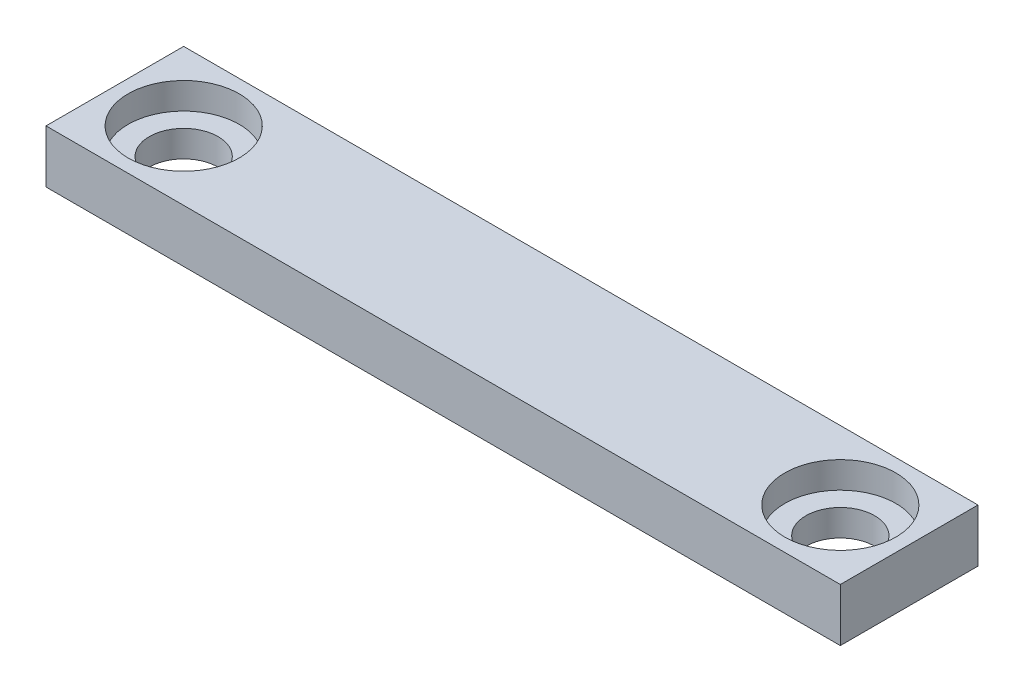
ISO-10303-21;
HEADER;
FILE_DESCRIPTION(('STEP AP214'),'2;1');
FILE_NAME('part.step','',(''),(''),'','','');
FILE_SCHEMA(('AUTOMOTIVE_DESIGN { 1 0 10303 214 1 1 1 1 }'));
ENDSEC;
DATA;
#1=APPLICATION_CONTEXT('core data for automotive mechanical design processes');
#2=APPLICATION_PROTOCOL_DEFINITION('international standard','automotive_design',2000,#1);
#3=PRODUCT_CONTEXT('',#1,'mechanical');
#4=PRODUCT('Part','Part','',(#3));
#5=PRODUCT_RELATED_PRODUCT_CATEGORY('part','',(#4));
#6=PRODUCT_DEFINITION_FORMATION('','',#4);
#7=PRODUCT_DEFINITION_CONTEXT('part definition',#1,'design');
#8=PRODUCT_DEFINITION('design','',#6,#7);
#9=PRODUCT_DEFINITION_SHAPE('','',#8);
#10=(LENGTH_UNIT() NAMED_UNIT(*) SI_UNIT(.MILLI.,.METRE.));
#11=(NAMED_UNIT(*) PLANE_ANGLE_UNIT() SI_UNIT($,.RADIAN.));
#12=(NAMED_UNIT(*) SI_UNIT($,.STERADIAN.) SOLID_ANGLE_UNIT());
#13=UNCERTAINTY_MEASURE_WITH_UNIT(LENGTH_MEASURE(1.E-05),#10,'distance_accuracy_value','');
#14=(GEOMETRIC_REPRESENTATION_CONTEXT(3) GLOBAL_UNCERTAINTY_ASSIGNED_CONTEXT((#13)) GLOBAL_UNIT_ASSIGNED_CONTEXT((#10,
#11,#12)) REPRESENTATION_CONTEXT('',''));
#15=CARTESIAN_POINT('',(0.,0.,0.));
#16=DIRECTION('',(0.,0.,1.));
#17=DIRECTION('',(1.,0.,0.));
#18=AXIS2_PLACEMENT_3D('',#15,#16,#17);
#19=CARTESIAN_POINT('',(0.,1.27,0.));
#20=DIRECTION('',(1.,0.,0.));
#21=DIRECTION('',(0.,0.,-1.));
#22=AXIS2_PLACEMENT_3D('',#19,#20,#21);
#23=PLANE('',#22);
#24=DIRECTION('',(0.,0.,1.));
#25=VECTOR('',#24,1.);
#26=CARTESIAN_POINT('',(0.,0.,0.));
#27=LINE('',#26,#25);
#28=CARTESIAN_POINT('',(0.,0.,-3.302));
#29=VERTEX_POINT('',#28);
#30=CARTESIAN_POINT('',(0.,0.,0.));
#31=VERTEX_POINT('',#30);
#32=EDGE_CURVE('E104',#29,#31,#27,.T.);
#33=ORIENTED_EDGE('',*,*,#32,.T.);
#34=DIRECTION('',(0.,-1.,0.));
#35=VECTOR('',#34,1.);
#36=CARTESIAN_POINT('',(0.,1.27,0.));
#37=LINE('',#36,#35);
#38=CARTESIAN_POINT('',(0.,1.27,0.));
#39=VERTEX_POINT('',#38);
#40=EDGE_CURVE('E11',#39,#31,#37,.T.);
#41=ORIENTED_EDGE('',*,*,#40,.F.);
#42=DIRECTION('',(0.,0.,1.));
#43=VECTOR('',#42,1.);
#44=CARTESIAN_POINT('',(0.,1.27,0.));
#45=LINE('',#44,#43);
#46=CARTESIAN_POINT('',(0.,1.27,-3.302));
#47=VERTEX_POINT('',#46);
#48=EDGE_CURVE('E92',#47,#39,#45,.T.);
#49=ORIENTED_EDGE('',*,*,#48,.F.);
#50=DIRECTION('',(0.,-1.,0.));
#51=VECTOR('',#50,1.);
#52=CARTESIAN_POINT('',(0.,1.27,-3.302));
#53=LINE('',#52,#51);
#54=EDGE_CURVE('E100',#47,#29,#53,.T.);
#55=ORIENTED_EDGE('',*,*,#54,.T.);
#56=EDGE_LOOP('',(#33,#41,#49,#55));
#57=FACE_BOUND('',#56,.T.);
#58=ADVANCED_FACE('F41',(#57),#23,.F.);
#59=CARTESIAN_POINT('',(0.,1.27,0.));
#60=DIRECTION('',(0.,0.,-1.));
#61=DIRECTION('',(-1.,0.,0.));
#62=AXIS2_PLACEMENT_3D('',#59,#60,#61);
#63=PLANE('',#62);
#64=DIRECTION('',(1.,0.,0.));
#65=VECTOR('',#64,1.);
#66=CARTESIAN_POINT('',(0.,0.,0.));
#67=LINE('',#66,#65);
#68=CARTESIAN_POINT('',(19.05,0.,0.));
#69=VERTEX_POINT('',#68);
#70=EDGE_CURVE('E96',#31,#69,#67,.T.);
#71=ORIENTED_EDGE('',*,*,#70,.T.);
#72=DIRECTION('',(0.,-1.,0.));
#73=VECTOR('',#72,1.);
#74=CARTESIAN_POINT('',(19.05,1.27,0.));
#75=LINE('',#74,#73);
#76=CARTESIAN_POINT('',(19.05,1.27,0.));
#77=VERTEX_POINT('',#76);
#78=EDGE_CURVE('E49',#77,#69,#75,.T.);
#79=ORIENTED_EDGE('',*,*,#78,.F.);
#80=DIRECTION('',(1.,0.,0.));
#81=VECTOR('',#80,1.);
#82=CARTESIAN_POINT('',(0.,1.27,0.));
#83=LINE('',#82,#81);
#84=EDGE_CURVE('E87',#39,#77,#83,.T.);
#85=ORIENTED_EDGE('',*,*,#84,.F.);
#86=ORIENTED_EDGE('',*,*,#40,.T.);
#87=EDGE_LOOP('',(#71,#79,#85,#86));
#88=FACE_BOUND('',#87,.T.);
#89=ADVANCED_FACE('F95',(#88),#63,.F.);
#90=CARTESIAN_POINT('',(19.05,1.27,0.));
#91=DIRECTION('',(-1.,0.,0.));
#92=DIRECTION('',(0.,0.,1.));
#93=AXIS2_PLACEMENT_3D('',#90,#91,#92);
#94=PLANE('',#93);
#95=DIRECTION('',(0.,0.,-1.));
#96=VECTOR('',#95,1.);
#97=CARTESIAN_POINT('',(19.05,0.,0.));
#98=LINE('',#97,#96);
#99=CARTESIAN_POINT('',(19.05,0.,-3.302));
#100=VERTEX_POINT('',#99);
#101=EDGE_CURVE('E74',#69,#100,#98,.T.);
#102=ORIENTED_EDGE('',*,*,#101,.T.);
#103=DIRECTION('',(0.,-1.,0.));
#104=VECTOR('',#103,1.);
#105=CARTESIAN_POINT('',(19.05,1.27,-3.302));
#106=LINE('',#105,#104);
#107=CARTESIAN_POINT('',(19.05,1.27,-3.302));
#108=VERTEX_POINT('',#107);
#109=EDGE_CURVE('E97',#108,#100,#106,.T.);
#110=ORIENTED_EDGE('',*,*,#109,.F.);
#111=DIRECTION('',(0.,0.,-1.));
#112=VECTOR('',#111,1.);
#113=CARTESIAN_POINT('',(19.05,1.27,0.));
#114=LINE('',#113,#112);
#115=EDGE_CURVE('E90',#77,#108,#114,.T.);
#116=ORIENTED_EDGE('',*,*,#115,.F.);
#117=ORIENTED_EDGE('',*,*,#78,.T.);
#118=EDGE_LOOP('',(#102,#110,#116,#117));
#119=FACE_BOUND('',#118,.T.);
#120=ADVANCED_FACE('F98',(#119),#94,.F.);
#121=CARTESIAN_POINT('',(0.,1.27,-3.302));
#122=DIRECTION('',(0.,0.,1.));
#123=DIRECTION('',(1.,0.,0.));
#124=AXIS2_PLACEMENT_3D('',#121,#122,#123);
#125=PLANE('',#124);
#126=DIRECTION('',(-1.,0.,0.));
#127=VECTOR('',#126,1.);
#128=CARTESIAN_POINT('',(0.,0.,-3.302));
#129=LINE('',#128,#127);
#130=EDGE_CURVE('E80',#100,#29,#129,.T.);
#131=ORIENTED_EDGE('',*,*,#130,.T.);
#132=ORIENTED_EDGE('',*,*,#54,.F.);
#133=DIRECTION('',(-1.,0.,0.));
#134=VECTOR('',#133,1.);
#135=CARTESIAN_POINT('',(0.,1.27,-3.302));
#136=LINE('',#135,#134);
#137=EDGE_CURVE('E57',#108,#47,#136,.T.);
#138=ORIENTED_EDGE('',*,*,#137,.F.);
#139=ORIENTED_EDGE('',*,*,#109,.T.);
#140=EDGE_LOOP('',(#131,#132,#138,#139));
#141=FACE_BOUND('',#140,.T.);
#142=ADVANCED_FACE('F112',(#141),#125,.F.);
#143=CARTESIAN_POINT('',(0.,1.27,0.));
#144=DIRECTION('',(0.,-1.,0.));
#145=DIRECTION('',(0.,0.,-1.));
#146=AXIS2_PLACEMENT_3D('',#143,#144,#145);
#147=PLANE('',#146);
#148=CARTESIAN_POINT('',(17.399,1.27,-1.651));
#149=DIRECTION('',(0.,1.,0.));
#150=DIRECTION('',(0.,0.,1.));
#151=AXIS2_PLACEMENT_3D('',#148,#149,#150);
#152=CIRCLE('',#151,1.3335);
#153=CARTESIAN_POINT('',(17.399,1.27,-0.317500000000002));
#154=VERTEX_POINT('',#153);
#155=EDGE_CURVE('E138',#154,#154,#152,.T.);
#156=ORIENTED_EDGE('',*,*,#155,.F.);
#157=EDGE_LOOP('',(#156));
#158=FACE_BOUND('',#157,.T.);
#159=CARTESIAN_POINT('',(1.651,1.27,-1.651));
#160=DIRECTION('',(0.,1.,0.));
#161=DIRECTION('',(0.,0.,1.));
#162=AXIS2_PLACEMENT_3D('',#159,#160,#161);
#163=CIRCLE('',#162,1.3335);
#164=CARTESIAN_POINT('',(1.651,1.27,-0.317500000000001));
#165=VERTEX_POINT('',#164);
#166=EDGE_CURVE('E126',#165,#165,#163,.T.);
#167=ORIENTED_EDGE('',*,*,#166,.F.);
#168=EDGE_LOOP('',(#167));
#169=FACE_BOUND('',#168,.T.);
#170=ORIENTED_EDGE('',*,*,#48,.T.);
#171=ORIENTED_EDGE('',*,*,#84,.T.);
#172=ORIENTED_EDGE('',*,*,#115,.T.);
#173=ORIENTED_EDGE('',*,*,#137,.T.);
#174=EDGE_LOOP('',(#170,#171,#172,#173));
#175=FACE_BOUND('',#174,.T.);
#176=ADVANCED_FACE('F88',(#158,#169,#175),#147,.F.);
#177=CARTESIAN_POINT('',(0.,0.,0.));
#178=DIRECTION('',(0.,-1.,0.));
#179=DIRECTION('',(0.,0.,-1.));
#180=AXIS2_PLACEMENT_3D('',#177,#178,#179);
#181=PLANE('',#180);
#182=CARTESIAN_POINT('',(17.399,0.,-1.651));
#183=DIRECTION('',(0.,1.,0.));
#184=DIRECTION('',(0.,0.,1.));
#185=AXIS2_PLACEMENT_3D('',#182,#183,#184);
#186=CIRCLE('',#185,0.8255);
#187=CARTESIAN_POINT('',(17.399,0.,-0.8255));
#188=VERTEX_POINT('',#187);
#189=EDGE_CURVE('E129',#188,#188,#186,.T.);
#190=ORIENTED_EDGE('',*,*,#189,.T.);
#191=EDGE_LOOP('',(#190));
#192=FACE_BOUND('',#191,.T.);
#193=CARTESIAN_POINT('',(1.651,0.,-1.651));
#194=DIRECTION('',(0.,1.,0.));
#195=DIRECTION('',(0.,0.,1.));
#196=AXIS2_PLACEMENT_3D('',#193,#194,#195);
#197=CIRCLE('',#196,0.8255);
#198=CARTESIAN_POINT('',(1.651,0.,-0.825499999999999));
#199=VERTEX_POINT('',#198);
#200=EDGE_CURVE('E107',#199,#199,#197,.T.);
#201=ORIENTED_EDGE('',*,*,#200,.T.);
#202=EDGE_LOOP('',(#201));
#203=FACE_BOUND('',#202,.T.);
#204=ORIENTED_EDGE('',*,*,#32,.F.);
#205=ORIENTED_EDGE('',*,*,#130,.F.);
#206=ORIENTED_EDGE('',*,*,#101,.F.);
#207=ORIENTED_EDGE('',*,*,#70,.F.);
#208=EDGE_LOOP('',(#204,#205,#206,#207));
#209=FACE_BOUND('',#208,.T.);
#210=ADVANCED_FACE('F115',(#192,#203,#209),#181,.T.);
#211=CARTESIAN_POINT('',(1.651,1.27,-1.651));
#212=DIRECTION('',(0.,1.,0.));
#213=DIRECTION('',(0.,0.,1.));
#214=AXIS2_PLACEMENT_3D('',#211,#212,#213);
#215=CYLINDRICAL_SURFACE('',#214,0.8255);
#216=ORIENTED_EDGE('',*,*,#200,.F.);
#217=EDGE_LOOP('',(#216));
#218=FACE_BOUND('',#217,.T.);
#219=CARTESIAN_POINT('',(1.651,0.635,-1.651));
#220=DIRECTION('',(0.,1.,0.));
#221=DIRECTION('',(0.,0.,1.));
#222=AXIS2_PLACEMENT_3D('',#219,#220,#221);
#223=CIRCLE('',#222,0.8255);
#224=CARTESIAN_POINT('',(1.651,0.635,-0.825499999999999));
#225=VERTEX_POINT('',#224);
#226=EDGE_CURVE('E120',#225,#225,#223,.T.);
#227=ORIENTED_EDGE('',*,*,#226,.T.);
#228=EDGE_LOOP('',(#227));
#229=FACE_BOUND('',#228,.T.);
#230=ADVANCED_FACE('F162',(#218,#229),#215,.F.);
#231=CARTESIAN_POINT('',(2.4765,0.635,-1.651));
#232=DIRECTION('',(0.,-1.,0.));
#233=DIRECTION('',(0.,0.,-1.));
#234=AXIS2_PLACEMENT_3D('',#231,#232,#233);
#235=PLANE('',#234);
#236=ORIENTED_EDGE('',*,*,#226,.F.);
#237=EDGE_LOOP('',(#236));
#238=FACE_BOUND('',#237,.T.);
#239=CARTESIAN_POINT('',(1.651,0.635,-1.651));
#240=DIRECTION('',(0.,1.,0.));
#241=DIRECTION('',(0.,0.,1.));
#242=AXIS2_PLACEMENT_3D('',#239,#240,#241);
#243=CIRCLE('',#242,1.3335);
#244=CARTESIAN_POINT('',(1.651,0.635,-0.317500000000001));
#245=VERTEX_POINT('',#244);
#246=EDGE_CURVE('E123',#245,#245,#243,.T.);
#247=ORIENTED_EDGE('',*,*,#246,.T.);
#248=EDGE_LOOP('',(#247));
#249=FACE_BOUND('',#248,.T.);
#250=ADVANCED_FACE('F152',(#238,#249),#235,.F.);
#251=CARTESIAN_POINT('',(1.651,1.27,-1.651));
#252=DIRECTION('',(0.,1.,0.));
#253=DIRECTION('',(0.,0.,1.));
#254=AXIS2_PLACEMENT_3D('',#251,#252,#253);
#255=CYLINDRICAL_SURFACE('',#254,1.3335);
#256=ORIENTED_EDGE('',*,*,#246,.F.);
#257=EDGE_LOOP('',(#256));
#258=FACE_BOUND('',#257,.T.);
#259=ORIENTED_EDGE('',*,*,#166,.T.);
#260=EDGE_LOOP('',(#259));
#261=FACE_BOUND('',#260,.T.);
#262=ADVANCED_FACE('F149',(#258,#261),#255,.F.);
#263=CARTESIAN_POINT('',(17.399,1.27,-1.651));
#264=DIRECTION('',(0.,1.,0.));
#265=DIRECTION('',(0.,0.,1.));
#266=AXIS2_PLACEMENT_3D('',#263,#264,#265);
#267=CYLINDRICAL_SURFACE('',#266,0.8255);
#268=ORIENTED_EDGE('',*,*,#189,.F.);
#269=EDGE_LOOP('',(#268));
#270=FACE_BOUND('',#269,.T.);
#271=CARTESIAN_POINT('',(17.399,0.635,-1.651));
#272=DIRECTION('',(0.,1.,0.));
#273=DIRECTION('',(0.,0.,1.));
#274=AXIS2_PLACEMENT_3D('',#271,#272,#273);
#275=CIRCLE('',#274,0.8255);
#276=CARTESIAN_POINT('',(17.399,0.635,-0.8255));
#277=VERTEX_POINT('',#276);
#278=EDGE_CURVE('E132',#277,#277,#275,.T.);
#279=ORIENTED_EDGE('',*,*,#278,.T.);
#280=EDGE_LOOP('',(#279));
#281=FACE_BOUND('',#280,.T.);
#282=ADVANCED_FACE('F151',(#270,#281),#267,.F.);
#283=CARTESIAN_POINT('',(18.2245,0.635,-1.651));
#284=DIRECTION('',(0.,-1.,0.));
#285=DIRECTION('',(0.,0.,-1.));
#286=AXIS2_PLACEMENT_3D('',#283,#284,#285);
#287=PLANE('',#286);
#288=ORIENTED_EDGE('',*,*,#278,.F.);
#289=EDGE_LOOP('',(#288));
#290=FACE_BOUND('',#289,.T.);
#291=CARTESIAN_POINT('',(17.399,0.635,-1.651));
#292=DIRECTION('',(0.,1.,0.));
#293=DIRECTION('',(0.,0.,1.));
#294=AXIS2_PLACEMENT_3D('',#291,#292,#293);
#295=CIRCLE('',#294,1.3335);
#296=CARTESIAN_POINT('',(17.399,0.635,-0.317500000000002));
#297=VERTEX_POINT('',#296);
#298=EDGE_CURVE('E135',#297,#297,#295,.T.);
#299=ORIENTED_EDGE('',*,*,#298,.T.);
#300=EDGE_LOOP('',(#299));
#301=FACE_BOUND('',#300,.T.);
#302=ADVANCED_FACE('F159',(#290,#301),#287,.F.);
#303=CARTESIAN_POINT('',(17.399,1.27,-1.651));
#304=DIRECTION('',(0.,1.,0.));
#305=DIRECTION('',(0.,0.,1.));
#306=AXIS2_PLACEMENT_3D('',#303,#304,#305);
#307=CYLINDRICAL_SURFACE('',#306,1.3335);
#308=ORIENTED_EDGE('',*,*,#298,.F.);
#309=EDGE_LOOP('',(#308));
#310=FACE_BOUND('',#309,.T.);
#311=ORIENTED_EDGE('',*,*,#155,.T.);
#312=EDGE_LOOP('',(#311));
#313=FACE_BOUND('',#312,.T.);
#314=ADVANCED_FACE('F142',(#310,#313),#307,.F.);
#315=CLOSED_SHELL('',(#58,#89,#120,#142,#176,#210,#230,#250,#262,#282,#302,#314));
#316=MANIFOLD_SOLID_BREP('B2',#315);
#317=ADVANCED_BREP_SHAPE_REPRESENTATION('',(#18,#316),#14);
#318=SHAPE_DEFINITION_REPRESENTATION(#9,#317);
ENDSEC;
END-ISO-10303-21;
